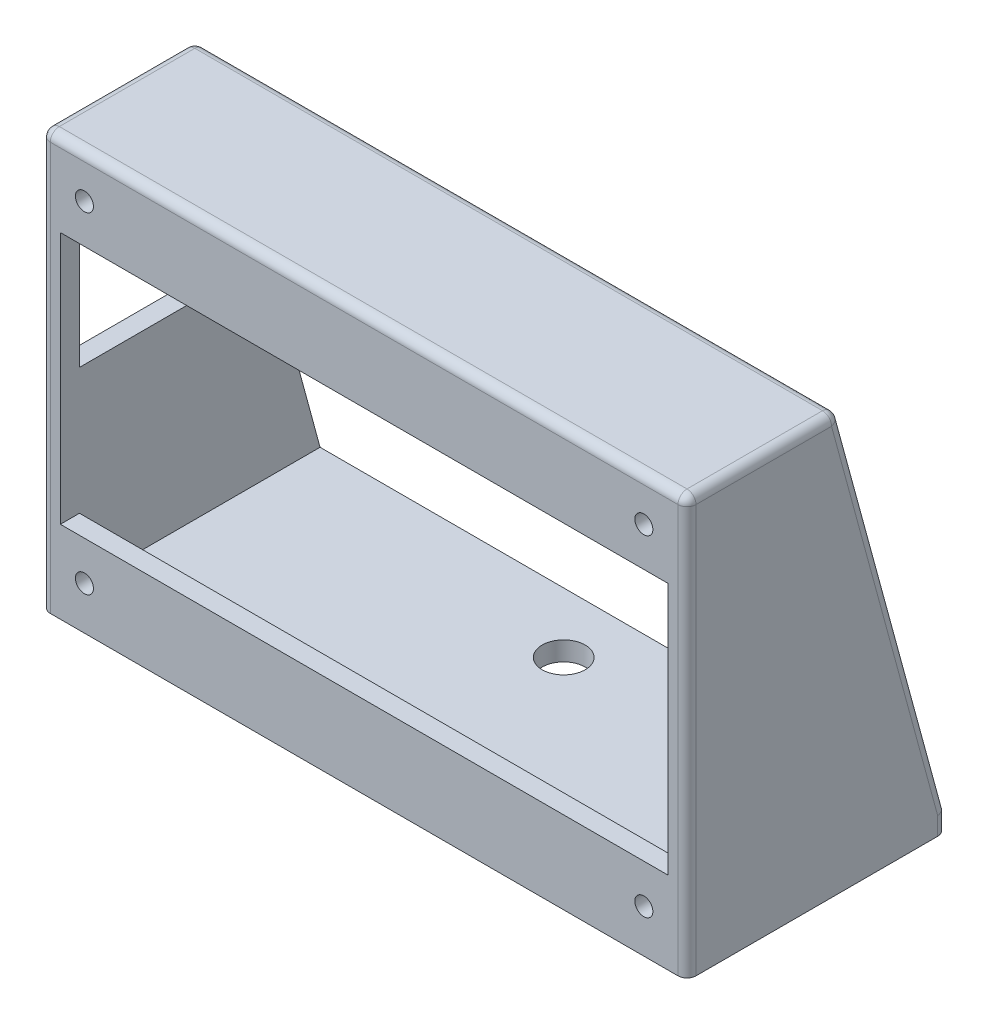
ISO-10303-21;
HEADER;
FILE_DESCRIPTION(('STEP AP214'),'2;1');
FILE_NAME('part.step','',(''),(''),'','','');
FILE_SCHEMA(('AUTOMOTIVE_DESIGN { 1 0 10303 214 1 1 1 1 }'));
ENDSEC;
DATA;
#1=APPLICATION_CONTEXT('core data for automotive mechanical design processes');
#2=APPLICATION_PROTOCOL_DEFINITION('international standard','automotive_design',2000,#1);
#3=PRODUCT_CONTEXT('',#1,'mechanical');
#4=PRODUCT('Part','Part','',(#3));
#5=PRODUCT_RELATED_PRODUCT_CATEGORY('part','',(#4));
#6=PRODUCT_DEFINITION_FORMATION('','',#4);
#7=PRODUCT_DEFINITION_CONTEXT('part definition',#1,'design');
#8=PRODUCT_DEFINITION('design','',#6,#7);
#9=PRODUCT_DEFINITION_SHAPE('','',#8);
#10=(LENGTH_UNIT() NAMED_UNIT(*) SI_UNIT(.MILLI.,.METRE.));
#11=(NAMED_UNIT(*) PLANE_ANGLE_UNIT() SI_UNIT($,.RADIAN.));
#12=(NAMED_UNIT(*) SI_UNIT($,.STERADIAN.) SOLID_ANGLE_UNIT());
#13=UNCERTAINTY_MEASURE_WITH_UNIT(LENGTH_MEASURE(1.E-05),#10,'distance_accuracy_value','');
#14=(GEOMETRIC_REPRESENTATION_CONTEXT(3) GLOBAL_UNCERTAINTY_ASSIGNED_CONTEXT((#13)) GLOBAL_UNIT_ASSIGNED_CONTEXT((#10,
#11,#12)) REPRESENTATION_CONTEXT('',''));
#15=CARTESIAN_POINT('',(0.,0.,0.));
#16=DIRECTION('',(0.,0.,1.));
#17=DIRECTION('',(1.,0.,0.));
#18=AXIS2_PLACEMENT_3D('',#15,#16,#17);
#19=CARTESIAN_POINT('',(53.675,34.675,-23.5875));
#20=DIRECTION('',(0.,-0.262469585009027,0.964940265998465));
#21=DIRECTION('',(0.,-0.964940265998465,-0.262469585009027));
#22=AXIS2_PLACEMENT_3D('',#19,#20,#21);
#23=PLANE('',#22);
#24=DIRECTION('',(-1.,0.,0.));
#25=VECTOR('',#24,1.);
#26=CARTESIAN_POINT('',(50.5,31.5,-24.4511191915376));
#27=LINE('',#26,#25);
#28=CARTESIAN_POINT('',(50.5,31.5,-24.4511191915376));
#29=VERTEX_POINT('',#28);
#30=CARTESIAN_POINT('',(-52.175,31.5,-24.4511191915376));
#31=VERTEX_POINT('',#30);
#32=EDGE_CURVE('E223',#29,#31,#27,.T.);
#33=ORIENTED_EDGE('',*,*,#32,.T.);
#34=DIRECTION('',(0.,0.964940265998465,0.262469585009027));
#35=VECTOR('',#34,1.);
#36=CARTESIAN_POINT('',(-52.175,34.675,-23.5875));
#37=LINE('',#36,#35);
#38=CARTESIAN_POINT('',(-52.175,33.5687043775135,-23.8884190964073));
#39=VERTEX_POINT('',#38);
#40=EDGE_CURVE('E359',#31,#39,#37,.T.);
#41=ORIENTED_EDGE('',*,*,#40,.T.);
#42=DIRECTION('',(-1.,0.,0.));
#43=VECTOR('',#42,1.);
#44=CARTESIAN_POINT('',(53.675,33.5687043775135,-23.8884190964073));
#45=LINE('',#44,#43);
#46=CARTESIAN_POINT('',(52.175,33.5687043775135,-23.8884190964073));
#47=VERTEX_POINT('',#46);
#48=EDGE_CURVE('E357',#39,#47,#45,.F.);
#49=ORIENTED_EDGE('',*,*,#48,.T.);
#50=DIRECTION('',(0.,0.964940265998465,0.262469585009027));
#51=VECTOR('',#50,1.);
#52=CARTESIAN_POINT('',(52.175,34.675,-23.5875));
#53=LINE('',#52,#51);
#54=CARTESIAN_POINT('',(52.175,-31.5,-41.5875));
#55=VERTEX_POINT('',#54);
#56=EDGE_CURVE('E355',#47,#55,#53,.F.);
#57=ORIENTED_EDGE('',*,*,#56,.T.);
#58=DIRECTION('',(-1.,0.,0.));
#59=VECTOR('',#58,1.);
#60=CARTESIAN_POINT('',(53.675,-31.5,-41.5875));
#61=LINE('',#60,#59);
#62=CARTESIAN_POINT('',(50.5,-31.5,-41.5875));
#63=VERTEX_POINT('',#62);
#64=EDGE_CURVE('E221',#55,#63,#61,.T.);
#65=ORIENTED_EDGE('',*,*,#64,.T.);
#66=DIRECTION('',(0.,-0.964940265998465,-0.262469585009027));
#67=VECTOR('',#66,1.);
#68=CARTESIAN_POINT('',(50.5,-11.5926491250708,-36.1725802304688));
#69=LINE('',#68,#67);
#70=EDGE_CURVE('E227',#29,#63,#69,.T.);
#71=ORIENTED_EDGE('',*,*,#70,.F.);
#72=EDGE_LOOP('',(#33,#41,#49,#57,#65,#71));
#73=FACE_BOUND('',#72,.T.);
#74=ADVANCED_FACE('F35',(#73),#23,.F.);
#75=CARTESIAN_POINT('',(0.,0.,-1.5875));
#76=DIRECTION('',(0.,0.,-1.));
#77=DIRECTION('',(-1.,0.,0.));
#78=AXIS2_PLACEMENT_3D('',#75,#76,#77);
#79=PLANE('',#78);
#80=CARTESIAN_POINT('',(-46.5,27.5,-1.5875));
#81=DIRECTION('',(0.,0.,1.));
#82=DIRECTION('',(1.,0.,0.));
#83=AXIS2_PLACEMENT_3D('',#80,#81,#82);
#84=CIRCLE('',#83,1.5);
#85=CARTESIAN_POINT('',(-45.,27.5,-1.5875));
#86=VERTEX_POINT('',#85);
#87=EDGE_CURVE('E265',#86,#86,#84,.T.);
#88=ORIENTED_EDGE('',*,*,#87,.T.);
#89=EDGE_LOOP('',(#88));
#90=FACE_BOUND('',#89,.T.);
#91=CARTESIAN_POINT('',(46.5,27.5,-1.5875));
#92=DIRECTION('',(0.,0.,1.));
#93=DIRECTION('',(1.,0.,0.));
#94=AXIS2_PLACEMENT_3D('',#91,#92,#93);
#95=CIRCLE('',#94,1.5);
#96=CARTESIAN_POINT('',(48.,27.5,-1.5875));
#97=VERTEX_POINT('',#96);
#98=EDGE_CURVE('E266',#97,#97,#95,.T.);
#99=ORIENTED_EDGE('',*,*,#98,.T.);
#100=EDGE_LOOP('',(#99));
#101=FACE_BOUND('',#100,.T.);
#102=DIRECTION('',(-1.,0.,0.));
#103=VECTOR('',#102,1.);
#104=CARTESIAN_POINT('',(-50.5,21.,-1.5875));
#105=LINE('',#104,#103);
#106=CARTESIAN_POINT('',(50.5,21.,-1.5875));
#107=VERTEX_POINT('',#106);
#108=CARTESIAN_POINT('',(-50.5,21.,-1.5875));
#109=VERTEX_POINT('',#108);
#110=EDGE_CURVE('E205',#107,#109,#105,.T.);
#111=ORIENTED_EDGE('',*,*,#110,.T.);
#112=DIRECTION('',(0.,-1.,0.));
#113=VECTOR('',#112,1.);
#114=CARTESIAN_POINT('',(-50.5,31.5,-1.5875));
#115=LINE('',#114,#113);
#116=CARTESIAN_POINT('',(-50.5,0.,-1.5875));
#117=VERTEX_POINT('',#116);
#118=EDGE_CURVE('E202',#109,#117,#115,.T.);
#119=ORIENTED_EDGE('',*,*,#118,.T.);
#120=DIRECTION('',(1.,0.,0.));
#121=VECTOR('',#120,1.);
#122=CARTESIAN_POINT('',(-75.9,0.,-1.5875));
#123=LINE('',#122,#121);
#124=CARTESIAN_POINT('',(-53.675,0.,-1.5875));
#125=VERTEX_POINT('',#124);
#126=EDGE_CURVE('E188',#125,#117,#123,.T.);
#127=ORIENTED_EDGE('',*,*,#126,.F.);
#128=DIRECTION('',(0.,-1.,0.));
#129=VECTOR('',#128,1.);
#130=CARTESIAN_POINT('',(-53.675,-34.675,-1.5875));
#131=LINE('',#130,#129);
#132=CARTESIAN_POINT('',(-53.675,31.5,-1.5875));
#133=VERTEX_POINT('',#132);
#134=EDGE_CURVE('E218',#133,#125,#131,.T.);
#135=ORIENTED_EDGE('',*,*,#134,.F.);
#136=DIRECTION('',(1.,0.,0.));
#137=VECTOR('',#136,1.);
#138=CARTESIAN_POINT('',(50.5,31.5,-1.5875));
#139=LINE('',#138,#137);
#140=CARTESIAN_POINT('',(50.5,31.5,-1.5875));
#141=VERTEX_POINT('',#140);
#142=EDGE_CURVE('E243',#133,#141,#139,.T.);
#143=ORIENTED_EDGE('',*,*,#142,.T.);
#144=DIRECTION('',(0.,-1.,0.));
#145=VECTOR('',#144,1.);
#146=CARTESIAN_POINT('',(50.5,-31.5,-1.5875));
#147=LINE('',#146,#145);
#148=EDGE_CURVE('E246',#141,#107,#147,.T.);
#149=ORIENTED_EDGE('',*,*,#148,.T.);
#150=EDGE_LOOP('',(#111,#119,#127,#135,#143,#149));
#151=FACE_BOUND('',#150,.T.);
#152=ADVANCED_FACE('F203',(#90,#101,#151),#79,.T.);
#153=CARTESIAN_POINT('',(46.5,-27.5,-1.5875));
#154=DIRECTION('',(0.,0.,1.));
#155=DIRECTION('',(1.,0.,0.));
#156=AXIS2_PLACEMENT_3D('',#153,#154,#155);
#157=CIRCLE('',#156,1.5);
#158=CARTESIAN_POINT('',(48.,-27.5,-1.5875));
#159=VERTEX_POINT('',#158);
#160=EDGE_CURVE('E273',#159,#159,#157,.T.);
#161=ORIENTED_EDGE('',*,*,#160,.T.);
#162=EDGE_LOOP('',(#161));
#163=FACE_BOUND('',#162,.T.);
#164=CARTESIAN_POINT('',(-46.5,-27.5,-1.5875));
#165=DIRECTION('',(0.,0.,1.));
#166=DIRECTION('',(1.,0.,0.));
#167=AXIS2_PLACEMENT_3D('',#164,#165,#166);
#168=CIRCLE('',#167,1.5);
#169=CARTESIAN_POINT('',(-45.,-27.5,-1.5875));
#170=VERTEX_POINT('',#169);
#171=EDGE_CURVE('E279',#170,#170,#168,.T.);
#172=ORIENTED_EDGE('',*,*,#171,.T.);
#173=EDGE_LOOP('',(#172));
#174=FACE_BOUND('',#173,.T.);
#175=DIRECTION('',(-1.,0.,0.));
#176=VECTOR('',#175,1.);
#177=CARTESIAN_POINT('',(50.5,-31.5,-1.5875));
#178=LINE('',#177,#176);
#179=CARTESIAN_POINT('',(50.5,-31.5,-1.5875));
#180=VERTEX_POINT('',#179);
#181=CARTESIAN_POINT('',(-50.5,-31.5,-1.5875));
#182=VERTEX_POINT('',#181);
#183=EDGE_CURVE('E241',#180,#182,#178,.T.);
#184=ORIENTED_EDGE('',*,*,#183,.T.);
#185=DIRECTION('',(0.,1.,0.));
#186=VECTOR('',#185,1.);
#187=CARTESIAN_POINT('',(-50.5,-31.5,-1.5875));
#188=LINE('',#187,#186);
#189=CARTESIAN_POINT('',(-50.5,-21.,-1.5875));
#190=VERTEX_POINT('',#189);
#191=EDGE_CURVE('E236',#182,#190,#188,.T.);
#192=ORIENTED_EDGE('',*,*,#191,.T.);
#193=DIRECTION('',(1.,0.,0.));
#194=VECTOR('',#193,1.);
#195=CARTESIAN_POINT('',(-50.5,-21.,-1.5875));
#196=LINE('',#195,#194);
#197=CARTESIAN_POINT('',(50.5,-21.,-1.5875));
#198=VERTEX_POINT('',#197);
#199=EDGE_CURVE('E297',#190,#198,#196,.T.);
#200=ORIENTED_EDGE('',*,*,#199,.T.);
#201=EDGE_CURVE('E248',#198,#180,#147,.T.);
#202=ORIENTED_EDGE('',*,*,#201,.T.);
#203=EDGE_LOOP('',(#184,#192,#200,#202));
#204=FACE_BOUND('',#203,.T.);
#205=ADVANCED_FACE('F519',(#163,#174,#204),#79,.T.);
#206=CARTESIAN_POINT('',(53.675,-34.675,1.5875));
#207=DIRECTION('',(-1.,0.,0.));
#208=DIRECTION('',(0.,0.,1.));
#209=AXIS2_PLACEMENT_3D('',#206,#207,#208);
#210=PLANE('',#209);
#211=DIRECTION('',(0.,0.,-1.));
#212=VECTOR('',#211,1.);
#213=CARTESIAN_POINT('',(53.675,-34.675,1.5875));
#214=LINE('',#213,#212);
#215=CARTESIAN_POINT('',(53.675,-34.675,0.0874999999999999));
#216=VERTEX_POINT('',#215);
#217=CARTESIAN_POINT('',(53.675,-34.675,-40.0875));
#218=VERTEX_POINT('',#217);
#219=EDGE_CURVE('E311',#216,#218,#214,.T.);
#220=ORIENTED_EDGE('',*,*,#219,.T.);
#221=DIRECTION('',(0.,-1.,0.));
#222=VECTOR('',#221,1.);
#223=CARTESIAN_POINT('',(53.675,-34.675,-40.0875));
#224=LINE('',#223,#222);
#225=CARTESIAN_POINT('',(53.675,-31.7003645527176,-40.0875));
#226=VERTEX_POINT('',#225);
#227=EDGE_CURVE('E339',#218,#226,#224,.F.);
#228=ORIENTED_EDGE('',*,*,#227,.T.);
#229=DIRECTION('',(0.,0.964940265998465,0.262469585009027));
#230=VECTOR('',#229,1.);
#231=CARTESIAN_POINT('',(53.675,-23.9151546608288,-37.9698758510918));
#232=LINE('',#231,#230);
#233=CARTESIAN_POINT('',(53.675,33.175,-22.4410086974097));
#234=VERTEX_POINT('',#233);
#235=EDGE_CURVE('E337',#226,#234,#232,.T.);
#236=ORIENTED_EDGE('',*,*,#235,.T.);
#237=DIRECTION('',(0.,0.,-1.));
#238=VECTOR('',#237,1.);
#239=CARTESIAN_POINT('',(53.675,33.175,1.5875));
#240=LINE('',#239,#238);
#241=CARTESIAN_POINT('',(53.675,33.175,0.0874999999999999));
#242=VERTEX_POINT('',#241);
#243=EDGE_CURVE('E335',#234,#242,#240,.F.);
#244=ORIENTED_EDGE('',*,*,#243,.T.);
#245=DIRECTION('',(0.,1.,0.));
#246=VECTOR('',#245,1.);
#247=CARTESIAN_POINT('',(53.675,-34.675,0.0874999999999999));
#248=LINE('',#247,#246);
#249=EDGE_CURVE('E333',#242,#216,#248,.F.);
#250=ORIENTED_EDGE('',*,*,#249,.T.);
#251=EDGE_LOOP('',(#220,#228,#236,#244,#250));
#252=FACE_BOUND('',#251,.T.);
#253=ADVANCED_FACE('F485',(#252),#210,.F.);
#254=CARTESIAN_POINT('',(-53.675,34.675,1.5875));
#255=DIRECTION('',(0.,-1.,0.));
#256=DIRECTION('',(0.,0.,-1.));
#257=AXIS2_PLACEMENT_3D('',#254,#255,#256);
#258=PLANE('',#257);
#259=DIRECTION('',(0.,0.,-1.));
#260=VECTOR('',#259,1.);
#261=CARTESIAN_POINT('',(52.175,34.675,1.5875));
#262=LINE('',#261,#260);
#263=CARTESIAN_POINT('',(52.175,34.675,0.0874999999999999));
#264=VERTEX_POINT('',#263);
#265=CARTESIAN_POINT('',(52.175,34.675,-22.4410086974097));
#266=VERTEX_POINT('',#265);
#267=EDGE_CURVE('E367',#264,#266,#262,.T.);
#268=ORIENTED_EDGE('',*,*,#267,.T.);
#269=DIRECTION('',(-1.,0.,0.));
#270=VECTOR('',#269,1.);
#271=CARTESIAN_POINT('',(-53.675,34.675,-22.4410086974097));
#272=LINE('',#271,#270);
#273=CARTESIAN_POINT('',(-52.175,34.675,-22.4410086974097));
#274=VERTEX_POINT('',#273);
#275=EDGE_CURVE('E369',#266,#274,#272,.T.);
#276=ORIENTED_EDGE('',*,*,#275,.T.);
#277=DIRECTION('',(0.,0.,-1.));
#278=VECTOR('',#277,1.);
#279=CARTESIAN_POINT('',(-52.175,34.675,1.5875));
#280=LINE('',#279,#278);
#281=CARTESIAN_POINT('',(-52.175,34.675,0.0874999999999999));
#282=VERTEX_POINT('',#281);
#283=EDGE_CURVE('E365',#274,#282,#280,.F.);
#284=ORIENTED_EDGE('',*,*,#283,.T.);
#285=DIRECTION('',(-1.,0.,0.));
#286=VECTOR('',#285,1.);
#287=CARTESIAN_POINT('',(-53.675,34.675,0.0874999999999999));
#288=LINE('',#287,#286);
#289=EDGE_CURVE('E363',#282,#264,#288,.F.);
#290=ORIENTED_EDGE('',*,*,#289,.T.);
#291=EDGE_LOOP('',(#268,#276,#284,#290));
#292=FACE_BOUND('',#291,.T.);
#293=ADVANCED_FACE('F425',(#292),#258,.F.);
#294=CARTESIAN_POINT('',(-53.675,-34.675,1.5875));
#295=DIRECTION('',(1.,0.,0.));
#296=DIRECTION('',(0.,0.,-1.));
#297=AXIS2_PLACEMENT_3D('',#294,#295,#296);
#298=PLANE('',#297);
#299=DIRECTION('',(0.,0.964940265998465,0.262469585009027));
#300=VECTOR('',#299,1.);
#301=CARTESIAN_POINT('',(-53.675,-23.9151546608288,-37.9698758510918));
#302=LINE('',#301,#300);
#303=CARTESIAN_POINT('',(-53.675,0.,-31.4648092263103));
#304=VERTEX_POINT('',#303);
#305=CARTESIAN_POINT('',(-53.675,-31.7003645527176,-40.0875));
#306=VERTEX_POINT('',#305);
#307=EDGE_CURVE('E347',#304,#306,#302,.F.);
#308=ORIENTED_EDGE('',*,*,#307,.T.);
#309=DIRECTION('',(0.,1.,0.));
#310=VECTOR('',#309,1.);
#311=CARTESIAN_POINT('',(-53.675,-34.675,-40.0875));
#312=LINE('',#311,#310);
#313=CARTESIAN_POINT('',(-53.675,-34.675,-40.0875));
#314=VERTEX_POINT('',#313);
#315=EDGE_CURVE('E349',#306,#314,#312,.F.);
#316=ORIENTED_EDGE('',*,*,#315,.T.);
#317=DIRECTION('',(0.,0.,-1.));
#318=VECTOR('',#317,1.);
#319=CARTESIAN_POINT('',(-53.675,-34.675,1.5875));
#320=LINE('',#319,#318);
#321=CARTESIAN_POINT('',(-53.675,-34.675,0.0874999999999999));
#322=VERTEX_POINT('',#321);
#323=EDGE_CURVE('E314',#322,#314,#320,.T.);
#324=ORIENTED_EDGE('',*,*,#323,.F.);
#325=DIRECTION('',(0.,-1.,0.));
#326=VECTOR('',#325,1.);
#327=CARTESIAN_POINT('',(-53.675,-34.675,0.0874999999999999));
#328=LINE('',#327,#326);
#329=CARTESIAN_POINT('',(-53.675,33.175,0.0874999999999999));
#330=VERTEX_POINT('',#329);
#331=EDGE_CURVE('E341',#322,#330,#328,.F.);
#332=ORIENTED_EDGE('',*,*,#331,.T.);
#333=DIRECTION('',(0.,0.,-1.));
#334=VECTOR('',#333,1.);
#335=CARTESIAN_POINT('',(-53.675,33.175,1.5875));
#336=LINE('',#335,#334);
#337=CARTESIAN_POINT('',(-53.675,33.175,-22.4410086974097));
#338=VERTEX_POINT('',#337);
#339=EDGE_CURVE('E343',#330,#338,#336,.T.);
#340=ORIENTED_EDGE('',*,*,#339,.T.);
#341=DIRECTION('',(0.,0.964940265998465,0.262469585009027));
#342=VECTOR('',#341,1.);
#343=CARTESIAN_POINT('',(-53.675,-23.9151546608288,-37.9698758510918));
#344=LINE('',#343,#342);
#345=CARTESIAN_POINT('',(-53.675,31.5,-22.8966188220791));
#346=VERTEX_POINT('',#345);
#347=EDGE_CURVE('E345',#338,#346,#344,.F.);
#348=ORIENTED_EDGE('',*,*,#347,.T.);
#349=DIRECTION('',(0.,0.,1.));
#350=VECTOR('',#349,1.);
#351=CARTESIAN_POINT('',(-53.675,31.5,1.5875));
#352=LINE('',#351,#350);
#353=EDGE_CURVE('E216',#346,#133,#352,.T.);
#354=ORIENTED_EDGE('',*,*,#353,.T.);
#355=ORIENTED_EDGE('',*,*,#134,.T.);
#356=DIRECTION('',(0.,0.,-1.));
#357=VECTOR('',#356,1.);
#358=CARTESIAN_POINT('',(-53.675,0.,1.5875));
#359=LINE('',#358,#357);
#360=EDGE_CURVE('E196',#125,#304,#359,.T.);
#361=ORIENTED_EDGE('',*,*,#360,.T.);
#362=EDGE_LOOP('',(#308,#316,#324,#332,#340,#348,#354,#355,#361));
#363=FACE_BOUND('',#362,.T.);
#364=ADVANCED_FACE('F434',(#363),#298,.F.);
#365=CARTESIAN_POINT('',(-53.675,-34.675,1.5875));
#366=DIRECTION('',(0.,1.,0.));
#367=DIRECTION('',(0.,0.,1.));
#368=AXIS2_PLACEMENT_3D('',#365,#366,#367);
#369=PLANE('',#368);
#370=CARTESIAN_POINT('',(0.,-34.675,-31.5875));
#371=DIRECTION('',(0.,1.,0.));
#372=DIRECTION('',(0.,0.,1.));
#373=AXIS2_PLACEMENT_3D('',#370,#371,#372);
#374=CIRCLE('',#373,3.571875);
#375=CARTESIAN_POINT('',(0.,-34.675,-28.015625));
#376=VERTEX_POINT('',#375);
#377=EDGE_CURVE('E233',#376,#376,#374,.T.);
#378=ORIENTED_EDGE('',*,*,#377,.T.);
#379=EDGE_LOOP('',(#378));
#380=FACE_BOUND('',#379,.T.);
#381=DIRECTION('',(-1.,0.,0.));
#382=VECTOR('',#381,1.);
#383=CARTESIAN_POINT('',(53.675,-34.675,-41.5875));
#384=LINE('',#383,#382);
#385=CARTESIAN_POINT('',(52.175,-34.675,-41.5875));
#386=VERTEX_POINT('',#385);
#387=CARTESIAN_POINT('',(-52.175,-34.675,-41.5875));
#388=VERTEX_POINT('',#387);
#389=EDGE_CURVE('E258',#386,#388,#384,.T.);
#390=ORIENTED_EDGE('',*,*,#389,.F.);
#391=CARTESIAN_POINT('',(52.175,-34.675,-40.0875));
#392=DIRECTION('',(0.,1.,0.));
#393=DIRECTION('',(0.,0.,1.));
#394=AXIS2_PLACEMENT_3D('',#391,#392,#393);
#395=CIRCLE('',#394,1.5);
#396=EDGE_CURVE('E331',#386,#218,#395,.F.);
#397=ORIENTED_EDGE('',*,*,#396,.T.);
#398=ORIENTED_EDGE('',*,*,#219,.F.);
#399=CARTESIAN_POINT('',(52.175,-34.675,0.0874999999999999));
#400=DIRECTION('',(0.,1.,0.));
#401=DIRECTION('',(0.,0.,1.));
#402=AXIS2_PLACEMENT_3D('',#399,#400,#401);
#403=CIRCLE('',#402,1.5);
#404=CARTESIAN_POINT('',(52.175,-34.675,1.5875));
#405=VERTEX_POINT('',#404);
#406=EDGE_CURVE('E327',#216,#405,#403,.F.);
#407=ORIENTED_EDGE('',*,*,#406,.T.);
#408=DIRECTION('',(1.,0.,0.));
#409=VECTOR('',#408,1.);
#410=CARTESIAN_POINT('',(-53.675,-34.675,1.5875));
#411=LINE('',#410,#409);
#412=CARTESIAN_POINT('',(-52.175,-34.675,1.5875));
#413=VERTEX_POINT('',#412);
#414=EDGE_CURVE('E303',#413,#405,#411,.T.);
#415=ORIENTED_EDGE('',*,*,#414,.F.);
#416=CARTESIAN_POINT('',(-52.175,-34.675,0.0874999999999999));
#417=DIRECTION('',(0.,1.,0.));
#418=DIRECTION('',(0.,0.,1.));
#419=AXIS2_PLACEMENT_3D('',#416,#417,#418);
#420=CIRCLE('',#419,1.5);
#421=EDGE_CURVE('E325',#413,#322,#420,.F.);
#422=ORIENTED_EDGE('',*,*,#421,.T.);
#423=ORIENTED_EDGE('',*,*,#323,.T.);
#424=CARTESIAN_POINT('',(-52.175,-34.675,-40.0875));
#425=DIRECTION('',(0.,1.,0.));
#426=DIRECTION('',(0.,0.,1.));
#427=AXIS2_PLACEMENT_3D('',#424,#425,#426);
#428=CIRCLE('',#427,1.5);
#429=EDGE_CURVE('E329',#314,#388,#428,.F.);
#430=ORIENTED_EDGE('',*,*,#429,.T.);
#431=EDGE_LOOP('',(#390,#397,#398,#407,#415,#422,#423,#430));
#432=FACE_BOUND('',#431,.T.);
#433=ADVANCED_FACE('F477',(#380,#432),#369,.F.);
#434=CARTESIAN_POINT('',(0.,0.,1.5875));
#435=DIRECTION('',(0.,0.,-1.));
#436=DIRECTION('',(-1.,0.,0.));
#437=AXIS2_PLACEMENT_3D('',#434,#435,#436);
#438=PLANE('',#437);
#439=CARTESIAN_POINT('',(-46.5,-27.5,1.5875));
#440=DIRECTION('',(0.,0.,1.));
#441=DIRECTION('',(1.,0.,0.));
#442=AXIS2_PLACEMENT_3D('',#439,#440,#441);
#443=CIRCLE('',#442,1.5);
#444=CARTESIAN_POINT('',(-45.,-27.5,1.5875));
#445=VERTEX_POINT('',#444);
#446=EDGE_CURVE('E261',#445,#445,#443,.T.);
#447=ORIENTED_EDGE('',*,*,#446,.F.);
#448=EDGE_LOOP('',(#447));
#449=FACE_BOUND('',#448,.T.);
#450=CARTESIAN_POINT('',(46.5,-27.5,1.5875));
#451=DIRECTION('',(0.,0.,1.));
#452=DIRECTION('',(1.,0.,0.));
#453=AXIS2_PLACEMENT_3D('',#450,#451,#452);
#454=CIRCLE('',#453,1.5);
#455=CARTESIAN_POINT('',(48.,-27.5,1.5875));
#456=VERTEX_POINT('',#455);
#457=EDGE_CURVE('E276',#456,#456,#454,.T.);
#458=ORIENTED_EDGE('',*,*,#457,.F.);
#459=EDGE_LOOP('',(#458));
#460=FACE_BOUND('',#459,.T.);
#461=CARTESIAN_POINT('',(46.5,27.5,1.5875));
#462=DIRECTION('',(0.,0.,1.));
#463=DIRECTION('',(1.,0.,0.));
#464=AXIS2_PLACEMENT_3D('',#461,#462,#463);
#465=CIRCLE('',#464,1.5);
#466=CARTESIAN_POINT('',(48.,27.5,1.5875));
#467=VERTEX_POINT('',#466);
#468=EDGE_CURVE('E270',#467,#467,#465,.T.);
#469=ORIENTED_EDGE('',*,*,#468,.F.);
#470=EDGE_LOOP('',(#469));
#471=FACE_BOUND('',#470,.T.);
#472=CARTESIAN_POINT('',(-46.5,27.5,1.5875));
#473=DIRECTION('',(0.,0.,1.));
#474=DIRECTION('',(1.,0.,0.));
#475=AXIS2_PLACEMENT_3D('',#472,#473,#474);
#476=CIRCLE('',#475,1.5);
#477=CARTESIAN_POINT('',(-45.,27.5,1.5875));
#478=VERTEX_POINT('',#477);
#479=EDGE_CURVE('E262',#478,#478,#476,.T.);
#480=ORIENTED_EDGE('',*,*,#479,.F.);
#481=EDGE_LOOP('',(#480));
#482=FACE_BOUND('',#481,.T.);
#483=DIRECTION('',(-1.,0.,0.));
#484=VECTOR('',#483,1.);
#485=CARTESIAN_POINT('',(-50.5,21.,1.5875));
#486=LINE('',#485,#484);
#487=CARTESIAN_POINT('',(50.5,21.,1.5875));
#488=VERTEX_POINT('',#487);
#489=CARTESIAN_POINT('',(-50.5,21.,1.5875));
#490=VERTEX_POINT('',#489);
#491=EDGE_CURVE('E287',#488,#490,#486,.T.);
#492=ORIENTED_EDGE('',*,*,#491,.F.);
#493=DIRECTION('',(0.,1.,0.));
#494=VECTOR('',#493,1.);
#495=CARTESIAN_POINT('',(50.5,-21.,1.5875));
#496=LINE('',#495,#494);
#497=CARTESIAN_POINT('',(50.5,-21.,1.5875));
#498=VERTEX_POINT('',#497);
#499=EDGE_CURVE('E269',#498,#488,#496,.T.);
#500=ORIENTED_EDGE('',*,*,#499,.F.);
#501=DIRECTION('',(1.,0.,0.));
#502=VECTOR('',#501,1.);
#503=CARTESIAN_POINT('',(-50.5,-21.,1.5875));
#504=LINE('',#503,#502);
#505=CARTESIAN_POINT('',(-50.5,-21.,1.5875));
#506=VERTEX_POINT('',#505);
#507=EDGE_CURVE('E293',#506,#498,#504,.T.);
#508=ORIENTED_EDGE('',*,*,#507,.F.);
#509=DIRECTION('',(0.,-1.,0.));
#510=VECTOR('',#509,1.);
#511=CARTESIAN_POINT('',(-50.5,-21.,1.5875));
#512=LINE('',#511,#510);
#513=EDGE_CURVE('E290',#490,#506,#512,.T.);
#514=ORIENTED_EDGE('',*,*,#513,.F.);
#515=EDGE_LOOP('',(#492,#500,#508,#514));
#516=FACE_BOUND('',#515,.T.);
#517=ORIENTED_EDGE('',*,*,#414,.T.);
#518=DIRECTION('',(0.,1.,0.));
#519=VECTOR('',#518,1.);
#520=CARTESIAN_POINT('',(52.175,0.,1.5875));
#521=LINE('',#520,#519);
#522=CARTESIAN_POINT('',(52.175,33.175,1.5875));
#523=VERTEX_POINT('',#522);
#524=EDGE_CURVE('E11',#405,#523,#521,.T.);
#525=ORIENTED_EDGE('',*,*,#524,.T.);
#526=DIRECTION('',(-1.,0.,0.));
#527=VECTOR('',#526,1.);
#528=CARTESIAN_POINT('',(0.,33.175,1.5875));
#529=LINE('',#528,#527);
#530=CARTESIAN_POINT('',(-52.175,33.175,1.5875));
#531=VERTEX_POINT('',#530);
#532=EDGE_CURVE('E44',#523,#531,#529,.T.);
#533=ORIENTED_EDGE('',*,*,#532,.T.);
#534=DIRECTION('',(0.,-1.,0.));
#535=VECTOR('',#534,1.);
#536=CARTESIAN_POINT('',(-52.175,0.,1.5875));
#537=LINE('',#536,#535);
#538=EDGE_CURVE('E372',#531,#413,#537,.T.);
#539=ORIENTED_EDGE('',*,*,#538,.T.);
#540=EDGE_LOOP('',(#517,#525,#533,#539));
#541=FACE_BOUND('',#540,.T.);
#542=ADVANCED_FACE('F571',(#449,#460,#471,#482,#516,#541),#438,.F.);
#543=CARTESIAN_POINT('',(50.5,-21.,-1.5875));
#544=DIRECTION('',(1.,0.,0.));
#545=DIRECTION('',(0.,0.,-1.));
#546=AXIS2_PLACEMENT_3D('',#543,#544,#545);
#547=PLANE('',#546);
#548=DIRECTION('',(0.,0.,1.));
#549=VECTOR('',#548,1.);
#550=CARTESIAN_POINT('',(50.5,31.5,-41.5875));
#551=LINE('',#550,#549);
#552=EDGE_CURVE('E256',#29,#141,#551,.T.);
#553=ORIENTED_EDGE('',*,*,#552,.F.);
#554=ORIENTED_EDGE('',*,*,#70,.T.);
#555=DIRECTION('',(0.,0.,1.));
#556=VECTOR('',#555,1.);
#557=CARTESIAN_POINT('',(50.5,-31.5,-41.5875));
#558=LINE('',#557,#556);
#559=EDGE_CURVE('E253',#63,#180,#558,.T.);
#560=ORIENTED_EDGE('',*,*,#559,.T.);
#561=ORIENTED_EDGE('',*,*,#201,.F.);
#562=DIRECTION('',(0.,0.,1.));
#563=VECTOR('',#562,1.);
#564=CARTESIAN_POINT('',(50.5,-21.,-1.5875));
#565=LINE('',#564,#563);
#566=EDGE_CURVE('E301',#198,#498,#565,.T.);
#567=ORIENTED_EDGE('',*,*,#566,.T.);
#568=ORIENTED_EDGE('',*,*,#499,.T.);
#569=DIRECTION('',(0.,0.,1.));
#570=VECTOR('',#569,1.);
#571=CARTESIAN_POINT('',(50.5,21.,-1.5875));
#572=LINE('',#571,#570);
#573=EDGE_CURVE('E300',#107,#488,#572,.T.);
#574=ORIENTED_EDGE('',*,*,#573,.F.);
#575=ORIENTED_EDGE('',*,*,#148,.F.);
#576=EDGE_LOOP('',(#553,#554,#560,#561,#567,#568,#574,#575));
#577=FACE_BOUND('',#576,.T.);
#578=ADVANCED_FACE('F452',(#577),#547,.F.);
#579=CARTESIAN_POINT('',(-50.5,-21.,-1.5875));
#580=DIRECTION('',(0.,-1.,0.));
#581=DIRECTION('',(0.,0.,-1.));
#582=AXIS2_PLACEMENT_3D('',#579,#580,#581);
#583=PLANE('',#582);
#584=ORIENTED_EDGE('',*,*,#566,.F.);
#585=ORIENTED_EDGE('',*,*,#199,.F.);
#586=DIRECTION('',(0.,0.,1.));
#587=VECTOR('',#586,1.);
#588=CARTESIAN_POINT('',(-50.5,-21.,-1.5875));
#589=LINE('',#588,#587);
#590=EDGE_CURVE('E304',#190,#506,#589,.T.);
#591=ORIENTED_EDGE('',*,*,#590,.T.);
#592=ORIENTED_EDGE('',*,*,#507,.T.);
#593=EDGE_LOOP('',(#584,#585,#591,#592));
#594=FACE_BOUND('',#593,.T.);
#595=ADVANCED_FACE('F560',(#594),#583,.F.);
#596=CARTESIAN_POINT('',(-50.5,-21.,-1.5875));
#597=DIRECTION('',(-1.,0.,0.));
#598=DIRECTION('',(0.,0.,1.));
#599=AXIS2_PLACEMENT_3D('',#596,#597,#598);
#600=PLANE('',#599);
#601=DIRECTION('',(0.,0.964940265998465,0.262469585009027));
#602=VECTOR('',#601,1.);
#603=CARTESIAN_POINT('',(-50.5,-11.5926491250708,-36.1725802304688));
#604=LINE('',#603,#602);
#605=CARTESIAN_POINT('',(-50.5,-31.5,-41.5875));
#606=VERTEX_POINT('',#605);
#607=CARTESIAN_POINT('',(-50.5,0.,-33.0193095957688));
#608=VERTEX_POINT('',#607);
#609=EDGE_CURVE('E212',#606,#608,#604,.T.);
#610=ORIENTED_EDGE('',*,*,#609,.T.);
#611=DIRECTION('',(0.,0.,-1.));
#612=VECTOR('',#611,1.);
#613=CARTESIAN_POINT('',(-50.5,0.,-1.5875));
#614=LINE('',#613,#612);
#615=EDGE_CURVE('E193',#117,#608,#614,.T.);
#616=ORIENTED_EDGE('',*,*,#615,.F.);
#617=ORIENTED_EDGE('',*,*,#118,.F.);
#618=DIRECTION('',(0.,0.,1.));
#619=VECTOR('',#618,1.);
#620=CARTESIAN_POINT('',(-50.5,21.,-1.5875));
#621=LINE('',#620,#619);
#622=EDGE_CURVE('E306',#109,#490,#621,.T.);
#623=ORIENTED_EDGE('',*,*,#622,.T.);
#624=ORIENTED_EDGE('',*,*,#513,.T.);
#625=ORIENTED_EDGE('',*,*,#590,.F.);
#626=ORIENTED_EDGE('',*,*,#191,.F.);
#627=DIRECTION('',(0.,0.,1.));
#628=VECTOR('',#627,1.);
#629=CARTESIAN_POINT('',(-50.5,-31.5,-41.5875));
#630=LINE('',#629,#628);
#631=EDGE_CURVE('E240',#606,#182,#630,.T.);
#632=ORIENTED_EDGE('',*,*,#631,.F.);
#633=EDGE_LOOP('',(#610,#616,#617,#623,#624,#625,#626,#632));
#634=FACE_BOUND('',#633,.T.);
#635=ADVANCED_FACE('F210',(#634),#600,.F.);
#636=CARTESIAN_POINT('',(-50.5,21.,-1.5875));
#637=DIRECTION('',(0.,1.,0.));
#638=DIRECTION('',(0.,0.,1.));
#639=AXIS2_PLACEMENT_3D('',#636,#637,#638);
#640=PLANE('',#639);
#641=ORIENTED_EDGE('',*,*,#622,.F.);
#642=ORIENTED_EDGE('',*,*,#110,.F.);
#643=ORIENTED_EDGE('',*,*,#573,.T.);
#644=ORIENTED_EDGE('',*,*,#491,.T.);
#645=EDGE_LOOP('',(#641,#642,#643,#644));
#646=FACE_BOUND('',#645,.T.);
#647=ADVANCED_FACE('F548',(#646),#640,.F.);
#648=CARTESIAN_POINT('',(-46.5,27.5,-1.5875));
#649=DIRECTION('',(0.,0.,1.));
#650=DIRECTION('',(1.,0.,0.));
#651=AXIS2_PLACEMENT_3D('',#648,#649,#650);
#652=CYLINDRICAL_SURFACE('',#651,1.5);
#653=ORIENTED_EDGE('',*,*,#87,.F.);
#654=EDGE_LOOP('',(#653));
#655=FACE_BOUND('',#654,.T.);
#656=ORIENTED_EDGE('',*,*,#479,.T.);
#657=EDGE_LOOP('',(#656));
#658=FACE_BOUND('',#657,.T.);
#659=ADVANCED_FACE('F544',(#655,#658),#652,.F.);
#660=CARTESIAN_POINT('',(46.5,27.5,-1.5875));
#661=DIRECTION('',(0.,0.,1.));
#662=DIRECTION('',(1.,0.,0.));
#663=AXIS2_PLACEMENT_3D('',#660,#661,#662);
#664=CYLINDRICAL_SURFACE('',#663,1.5);
#665=ORIENTED_EDGE('',*,*,#98,.F.);
#666=EDGE_LOOP('',(#665));
#667=FACE_BOUND('',#666,.T.);
#668=ORIENTED_EDGE('',*,*,#468,.T.);
#669=EDGE_LOOP('',(#668));
#670=FACE_BOUND('',#669,.T.);
#671=ADVANCED_FACE('F547',(#667,#670),#664,.F.);
#672=CARTESIAN_POINT('',(46.5,-27.5,-1.5875));
#673=DIRECTION('',(0.,0.,1.));
#674=DIRECTION('',(1.,0.,0.));
#675=AXIS2_PLACEMENT_3D('',#672,#673,#674);
#676=CYLINDRICAL_SURFACE('',#675,1.5);
#677=ORIENTED_EDGE('',*,*,#160,.F.);
#678=EDGE_LOOP('',(#677));
#679=FACE_BOUND('',#678,.T.);
#680=ORIENTED_EDGE('',*,*,#457,.T.);
#681=EDGE_LOOP('',(#680));
#682=FACE_BOUND('',#681,.T.);
#683=ADVANCED_FACE('F552',(#679,#682),#676,.F.);
#684=CARTESIAN_POINT('',(-46.5,-27.5,-1.5875));
#685=DIRECTION('',(0.,0.,1.));
#686=DIRECTION('',(1.,0.,0.));
#687=AXIS2_PLACEMENT_3D('',#684,#685,#686);
#688=CYLINDRICAL_SURFACE('',#687,1.5);
#689=ORIENTED_EDGE('',*,*,#171,.F.);
#690=EDGE_LOOP('',(#689));
#691=FACE_BOUND('',#690,.T.);
#692=ORIENTED_EDGE('',*,*,#446,.T.);
#693=EDGE_LOOP('',(#692));
#694=FACE_BOUND('',#693,.T.);
#695=ADVANCED_FACE('F543',(#691,#694),#688,.F.);
#696=CARTESIAN_POINT('',(0.,0.,-41.5875));
#697=DIRECTION('',(0.,0.,1.));
#698=DIRECTION('',(1.,0.,0.));
#699=AXIS2_PLACEMENT_3D('',#696,#697,#698);
#700=PLANE('',#699);
#701=ORIENTED_EDGE('',*,*,#64,.F.);
#702=DIRECTION('',(0.,-1.,0.));
#703=VECTOR('',#702,1.);
#704=CARTESIAN_POINT('',(52.175,0.,-41.5875));
#705=LINE('',#704,#703);
#706=EDGE_CURVE('E322',#55,#386,#705,.T.);
#707=ORIENTED_EDGE('',*,*,#706,.T.);
#708=ORIENTED_EDGE('',*,*,#389,.T.);
#709=DIRECTION('',(0.,1.,0.));
#710=VECTOR('',#709,1.);
#711=CARTESIAN_POINT('',(-52.175,0.,-41.5875));
#712=LINE('',#711,#710);
#713=CARTESIAN_POINT('',(-52.175,-31.5,-41.5875));
#714=VERTEX_POINT('',#713);
#715=EDGE_CURVE('E319',#388,#714,#712,.T.);
#716=ORIENTED_EDGE('',*,*,#715,.T.);
#717=EDGE_CURVE('E220',#606,#714,#61,.T.);
#718=ORIENTED_EDGE('',*,*,#717,.F.);
#719=DIRECTION('',(-1.,0.,0.));
#720=VECTOR('',#719,1.);
#721=CARTESIAN_POINT('',(50.5,-31.5,-41.5875));
#722=LINE('',#721,#720);
#723=EDGE_CURVE('E237',#63,#606,#722,.T.);
#724=ORIENTED_EDGE('',*,*,#723,.F.);
#725=EDGE_LOOP('',(#701,#707,#708,#716,#718,#724));
#726=FACE_BOUND('',#725,.T.);
#727=ADVANCED_FACE('F460',(#726),#700,.F.);
#728=CARTESIAN_POINT('',(50.5,31.5,-41.5875));
#729=DIRECTION('',(0.,-1.,0.));
#730=DIRECTION('',(0.,0.,-1.));
#731=AXIS2_PLACEMENT_3D('',#728,#729,#730);
#732=PLANE('',#731);
#733=ORIENTED_EDGE('',*,*,#353,.F.);
#734=CARTESIAN_POINT('',(-52.175,31.5,-22.8966188220791));
#735=DIRECTION('',(0.,-1.,0.));
#736=DIRECTION('',(0.,0.,1.));
#737=AXIS2_PLACEMENT_3D('',#734,#735,#736);
#738=ELLIPSE('',#737,1.5545003694585,1.5);
#739=EDGE_CURVE('E361',#346,#31,#738,.T.);
#740=ORIENTED_EDGE('',*,*,#739,.T.);
#741=ORIENTED_EDGE('',*,*,#32,.F.);
#742=ORIENTED_EDGE('',*,*,#552,.T.);
#743=ORIENTED_EDGE('',*,*,#142,.F.);
#744=EDGE_LOOP('',(#733,#740,#741,#742,#743));
#745=FACE_BOUND('',#744,.T.);
#746=ADVANCED_FACE('F445',(#745),#732,.T.);
#747=CARTESIAN_POINT('',(50.5,-31.5,-41.5875));
#748=DIRECTION('',(0.,1.,0.));
#749=DIRECTION('',(0.,0.,1.));
#750=AXIS2_PLACEMENT_3D('',#747,#748,#749);
#751=PLANE('',#750);
#752=CARTESIAN_POINT('',(0.,-31.5,-31.5875));
#753=DIRECTION('',(0.,1.,0.));
#754=DIRECTION('',(0.,0.,1.));
#755=AXIS2_PLACEMENT_3D('',#752,#753,#754);
#756=CIRCLE('',#755,3.571875);
#757=CARTESIAN_POINT('',(0.,-31.5,-28.015625));
#758=VERTEX_POINT('',#757);
#759=EDGE_CURVE('E230',#758,#758,#756,.T.);
#760=ORIENTED_EDGE('',*,*,#759,.F.);
#761=EDGE_LOOP('',(#760));
#762=FACE_BOUND('',#761,.T.);
#763=ORIENTED_EDGE('',*,*,#183,.F.);
#764=ORIENTED_EDGE('',*,*,#559,.F.);
#765=ORIENTED_EDGE('',*,*,#723,.T.);
#766=ORIENTED_EDGE('',*,*,#631,.T.);
#767=EDGE_LOOP('',(#763,#764,#765,#766));
#768=FACE_BOUND('',#767,.T.);
#769=ADVANCED_FACE('F457',(#762,#768),#751,.T.);
#770=CARTESIAN_POINT('',(0.,-56.9,-31.5875));
#771=DIRECTION('',(0.,1.,0.));
#772=DIRECTION('',(0.,0.,1.));
#773=AXIS2_PLACEMENT_3D('',#770,#771,#772);
#774=CYLINDRICAL_SURFACE('',#773,3.571875);
#775=ORIENTED_EDGE('',*,*,#759,.T.);
#776=EDGE_LOOP('',(#775));
#777=FACE_BOUND('',#776,.T.);
#778=ORIENTED_EDGE('',*,*,#377,.F.);
#779=EDGE_LOOP('',(#778));
#780=FACE_BOUND('',#779,.T.);
#781=ADVANCED_FACE('F525',(#777,#780),#774,.F.);
#782=ORIENTED_EDGE('',*,*,#717,.T.);
#783=DIRECTION('',(0.,0.964940265998465,0.262469585009027));
#784=VECTOR('',#783,1.);
#785=CARTESIAN_POINT('',(-52.175,34.675,-23.5875));
#786=LINE('',#785,#784);
#787=CARTESIAN_POINT('',(-52.175,0.,-33.0193095957688));
#788=VERTEX_POINT('',#787);
#789=EDGE_CURVE('E351',#714,#788,#786,.T.);
#790=ORIENTED_EDGE('',*,*,#789,.T.);
#791=DIRECTION('',(1.,0.,0.));
#792=VECTOR('',#791,1.);
#793=CARTESIAN_POINT('',(53.675,0.,-33.0193095957688));
#794=LINE('',#793,#792);
#795=EDGE_CURVE('E317',#788,#608,#794,.T.);
#796=ORIENTED_EDGE('',*,*,#795,.T.);
#797=ORIENTED_EDGE('',*,*,#609,.F.);
#798=EDGE_LOOP('',(#782,#790,#796,#797));
#799=FACE_BOUND('',#798,.T.);
#800=ADVANCED_FACE('F465',(#799),#23,.F.);
#801=CARTESIAN_POINT('',(-75.9,0.,-1.5875));
#802=DIRECTION('',(0.,-1.,0.));
#803=DIRECTION('',(0.,0.,-1.));
#804=AXIS2_PLACEMENT_3D('',#801,#802,#803);
#805=PLANE('',#804);
#806=ORIENTED_EDGE('',*,*,#795,.F.);
#807=CARTESIAN_POINT('',(-52.175,0.,-31.4648092263103));
#808=DIRECTION('',(0.,-1.,0.));
#809=DIRECTION('',(0.,0.,1.));
#810=AXIS2_PLACEMENT_3D('',#807,#808,#809);
#811=ELLIPSE('',#810,1.5545003694585,1.5);
#812=EDGE_CURVE('E353',#788,#304,#811,.F.);
#813=ORIENTED_EDGE('',*,*,#812,.T.);
#814=ORIENTED_EDGE('',*,*,#360,.F.);
#815=ORIENTED_EDGE('',*,*,#126,.T.);
#816=ORIENTED_EDGE('',*,*,#615,.T.);
#817=EDGE_LOOP('',(#806,#813,#814,#815,#816));
#818=FACE_BOUND('',#817,.T.);
#819=ADVANCED_FACE('F191',(#818),#805,.F.);
#820=CARTESIAN_POINT('',(-52.175,0.,0.0874999999999999));
#821=DIRECTION('',(0.,-1.,0.));
#822=DIRECTION('',(0.,0.,-1.));
#823=AXIS2_PLACEMENT_3D('',#820,#821,#822);
#824=CYLINDRICAL_SURFACE('',#823,1.5);
#825=CARTESIAN_POINT('',(-52.175,33.175,0.0874999999999999));
#826=DIRECTION('',(0.,1.,0.));
#827=DIRECTION('',(0.,0.,1.));
#828=AXIS2_PLACEMENT_3D('',#825,#826,#827);
#829=CIRCLE('',#828,1.5);
#830=EDGE_CURVE('E208',#330,#531,#829,.T.);
#831=ORIENTED_EDGE('',*,*,#830,.F.);
#832=ORIENTED_EDGE('',*,*,#331,.F.);
#833=ORIENTED_EDGE('',*,*,#421,.F.);
#834=ORIENTED_EDGE('',*,*,#538,.F.);
#835=EDGE_LOOP('',(#831,#832,#833,#834));
#836=FACE_BOUND('',#835,.T.);
#837=ADVANCED_FACE('F530',(#836),#824,.T.);
#838=CARTESIAN_POINT('',(-52.175,33.175,0.0874999999999999));
#839=DIRECTION('',(0.,0.,1.));
#840=DIRECTION('',(1.,0.,0.));
#841=AXIS2_PLACEMENT_3D('',#838,#839,#840);
#842=SPHERICAL_SURFACE('',#841,1.5);
#843=CARTESIAN_POINT('',(-52.175,33.175,0.0874999999999999));
#844=DIRECTION('',(0.,0.,1.));
#845=DIRECTION('',(1.,0.,0.));
#846=AXIS2_PLACEMENT_3D('',#843,#844,#845);
#847=CIRCLE('',#846,1.5);
#848=EDGE_CURVE('E404',#330,#282,#847,.F.);
#849=ORIENTED_EDGE('',*,*,#848,.F.);
#850=ORIENTED_EDGE('',*,*,#830,.T.);
#851=CARTESIAN_POINT('',(-52.175,33.175,0.0874999999999999));
#852=DIRECTION('',(-1.,0.,0.));
#853=DIRECTION('',(0.,0.,1.));
#854=AXIS2_PLACEMENT_3D('',#851,#852,#853);
#855=CIRCLE('',#854,1.5);
#856=EDGE_CURVE('E407',#282,#531,#855,.F.);
#857=ORIENTED_EDGE('',*,*,#856,.F.);
#858=EDGE_LOOP('',(#849,#850,#857));
#859=FACE_BOUND('',#858,.T.);
#860=ADVANCED_FACE('F414',(#859),#842,.T.);
#861=CARTESIAN_POINT('',(52.175,0.,0.0874999999999999));
#862=DIRECTION('',(0.,1.,0.));
#863=DIRECTION('',(0.,0.,1.));
#864=AXIS2_PLACEMENT_3D('',#861,#862,#863);
#865=CYLINDRICAL_SURFACE('',#864,1.5);
#866=ORIENTED_EDGE('',*,*,#406,.F.);
#867=ORIENTED_EDGE('',*,*,#249,.F.);
#868=CARTESIAN_POINT('',(52.175,33.175,0.0874999999999999));
#869=DIRECTION('',(0.,1.,0.));
#870=DIRECTION('',(0.,0.,1.));
#871=AXIS2_PLACEMENT_3D('',#868,#869,#870);
#872=CIRCLE('',#871,1.5);
#873=EDGE_CURVE('E401',#523,#242,#872,.T.);
#874=ORIENTED_EDGE('',*,*,#873,.F.);
#875=ORIENTED_EDGE('',*,*,#524,.F.);
#876=EDGE_LOOP('',(#866,#867,#874,#875));
#877=FACE_BOUND('',#876,.T.);
#878=ADVANCED_FACE('F490',(#877),#865,.T.);
#879=CARTESIAN_POINT('',(0.,33.175,0.0874999999999999));
#880=DIRECTION('',(-1.,0.,0.));
#881=DIRECTION('',(0.,0.,1.));
#882=AXIS2_PLACEMENT_3D('',#879,#880,#881);
#883=CYLINDRICAL_SURFACE('',#882,1.5);
#884=ORIENTED_EDGE('',*,*,#856,.T.);
#885=ORIENTED_EDGE('',*,*,#532,.F.);
#886=CARTESIAN_POINT('',(52.175,33.175,0.0874999999999999));
#887=DIRECTION('',(1.,0.,0.));
#888=DIRECTION('',(0.,0.,-1.));
#889=AXIS2_PLACEMENT_3D('',#886,#887,#888);
#890=CIRCLE('',#889,1.5);
#891=EDGE_CURVE('E398',#264,#523,#890,.T.);
#892=ORIENTED_EDGE('',*,*,#891,.F.);
#893=ORIENTED_EDGE('',*,*,#289,.F.);
#894=EDGE_LOOP('',(#884,#885,#892,#893));
#895=FACE_BOUND('',#894,.T.);
#896=ADVANCED_FACE('F420',(#895),#883,.T.);
#897=CARTESIAN_POINT('',(-52.175,33.175,1.5875));
#898=DIRECTION('',(0.,0.,-1.));
#899=DIRECTION('',(-1.,0.,0.));
#900=AXIS2_PLACEMENT_3D('',#897,#898,#899);
#901=CYLINDRICAL_SURFACE('',#900,1.5);
#902=ORIENTED_EDGE('',*,*,#848,.T.);
#903=ORIENTED_EDGE('',*,*,#283,.F.);
#904=CARTESIAN_POINT('',(-52.175,33.175,-22.4410086974097));
#905=DIRECTION('',(0.,0.,-1.));
#906=DIRECTION('',(-1.,0.,0.));
#907=AXIS2_PLACEMENT_3D('',#904,#905,#906);
#908=CIRCLE('',#907,1.5);
#909=EDGE_CURVE('E395',#338,#274,#908,.T.);
#910=ORIENTED_EDGE('',*,*,#909,.F.);
#911=ORIENTED_EDGE('',*,*,#339,.F.);
#912=EDGE_LOOP('',(#902,#903,#910,#911));
#913=FACE_BOUND('',#912,.T.);
#914=ADVANCED_FACE('F431',(#913),#901,.T.);
#915=CARTESIAN_POINT('',(-52.175,34.2812956224865,-22.1400896010023));
#916=DIRECTION('',(0.,0.964940265998465,0.262469585009027));
#917=DIRECTION('',(0.,-0.262469585009027,0.964940265998465));
#918=AXIS2_PLACEMENT_3D('',#915,#916,#917);
#919=CYLINDRICAL_SURFACE('',#918,1.5);
#920=ORIENTED_EDGE('',*,*,#739,.F.);
#921=ORIENTED_EDGE('',*,*,#347,.F.);
#922=CARTESIAN_POINT('',(-52.175,33.175,-22.4410086974097));
#923=DIRECTION('',(0.,0.964940265998465,0.262469585009028));
#924=DIRECTION('',(0.,-0.262469585009028,0.964940265998465));
#925=AXIS2_PLACEMENT_3D('',#922,#923,#924);
#926=CIRCLE('',#925,1.5);
#927=EDGE_CURVE('E392',#39,#338,#926,.T.);
#928=ORIENTED_EDGE('',*,*,#927,.F.);
#929=ORIENTED_EDGE('',*,*,#40,.F.);
#930=EDGE_LOOP('',(#920,#921,#928,#929));
#931=FACE_BOUND('',#930,.T.);
#932=ADVANCED_FACE('F440',(#931),#919,.T.);
#933=CARTESIAN_POINT('',(52.175,33.175,0.0874999999999999));
#934=DIRECTION('',(0.,0.,1.));
#935=DIRECTION('',(1.,0.,0.));
#936=AXIS2_PLACEMENT_3D('',#933,#934,#935);
#937=SPHERICAL_SURFACE('',#936,1.5);
#938=ORIENTED_EDGE('',*,*,#891,.T.);
#939=ORIENTED_EDGE('',*,*,#873,.T.);
#940=CARTESIAN_POINT('',(52.175,33.175,0.0874999999999999));
#941=DIRECTION('',(0.,0.,1.));
#942=DIRECTION('',(1.,0.,0.));
#943=AXIS2_PLACEMENT_3D('',#940,#941,#942);
#944=CIRCLE('',#943,1.5);
#945=EDGE_CURVE('E389',#264,#242,#944,.F.);
#946=ORIENTED_EDGE('',*,*,#945,.F.);
#947=EDGE_LOOP('',(#938,#939,#946));
#948=FACE_BOUND('',#947,.T.);
#949=ADVANCED_FACE('F492',(#948),#937,.T.);
#950=CARTESIAN_POINT('',(-52.175,33.175,-22.4410086974097));
#951=DIRECTION('',(0.,0.,1.));
#952=DIRECTION('',(1.,0.,0.));
#953=AXIS2_PLACEMENT_3D('',#950,#951,#952);
#954=SPHERICAL_SURFACE('',#953,1.5);
#955=ORIENTED_EDGE('',*,*,#927,.T.);
#956=ORIENTED_EDGE('',*,*,#909,.T.);
#957=CARTESIAN_POINT('',(-52.175,33.175,-22.4410086974097));
#958=DIRECTION('',(-1.,0.,0.));
#959=DIRECTION('',(0.,0.,1.));
#960=AXIS2_PLACEMENT_3D('',#957,#958,#959);
#961=CIRCLE('',#960,1.5);
#962=EDGE_CURVE('E387',#39,#274,#961,.F.);
#963=ORIENTED_EDGE('',*,*,#962,.F.);
#964=EDGE_LOOP('',(#955,#956,#963));
#965=FACE_BOUND('',#964,.T.);
#966=ADVANCED_FACE('F505',(#965),#954,.T.);
#967=CARTESIAN_POINT('',(52.175,33.175,1.5875));
#968=DIRECTION('',(0.,0.,-1.));
#969=DIRECTION('',(-1.,0.,0.));
#970=AXIS2_PLACEMENT_3D('',#967,#968,#969);
#971=CYLINDRICAL_SURFACE('',#970,1.5);
#972=ORIENTED_EDGE('',*,*,#945,.T.);
#973=ORIENTED_EDGE('',*,*,#243,.F.);
#974=CARTESIAN_POINT('',(52.175,33.175,-22.4410086974097));
#975=DIRECTION('',(0.,0.,-1.));
#976=DIRECTION('',(-1.,0.,0.));
#977=AXIS2_PLACEMENT_3D('',#974,#975,#976);
#978=CIRCLE('',#977,1.5);
#979=EDGE_CURVE('E384',#266,#234,#978,.T.);
#980=ORIENTED_EDGE('',*,*,#979,.F.);
#981=ORIENTED_EDGE('',*,*,#267,.F.);
#982=EDGE_LOOP('',(#972,#973,#980,#981));
#983=FACE_BOUND('',#982,.T.);
#984=ADVANCED_FACE('F494',(#983),#971,.T.);
#985=CARTESIAN_POINT('',(-53.675,33.175,-22.4410086974097));
#986=DIRECTION('',(-1.,0.,0.));
#987=DIRECTION('',(0.,0.,1.));
#988=AXIS2_PLACEMENT_3D('',#985,#986,#987);
#989=CYLINDRICAL_SURFACE('',#988,1.5);
#990=ORIENTED_EDGE('',*,*,#962,.T.);
#991=ORIENTED_EDGE('',*,*,#275,.F.);
#992=CARTESIAN_POINT('',(52.175,33.175,-22.4410086974097));
#993=DIRECTION('',(1.,0.,0.));
#994=DIRECTION('',(0.,0.,-1.));
#995=AXIS2_PLACEMENT_3D('',#992,#993,#994);
#996=CIRCLE('',#995,1.5);
#997=EDGE_CURVE('E381',#47,#266,#996,.T.);
#998=ORIENTED_EDGE('',*,*,#997,.F.);
#999=ORIENTED_EDGE('',*,*,#48,.F.);
#1000=EDGE_LOOP('',(#990,#991,#998,#999));
#1001=FACE_BOUND('',#1000,.T.);
#1002=ADVANCED_FACE('F503',(#1001),#989,.T.);
#1003=CARTESIAN_POINT('',(52.175,33.175,-22.4410086974097));
#1004=DIRECTION('',(0.,0.,1.));
#1005=DIRECTION('',(1.,0.,0.));
#1006=AXIS2_PLACEMENT_3D('',#1003,#1004,#1005);
#1007=SPHERICAL_SURFACE('',#1006,1.5);
#1008=ORIENTED_EDGE('',*,*,#997,.T.);
#1009=ORIENTED_EDGE('',*,*,#979,.T.);
#1010=CARTESIAN_POINT('',(52.175,33.175,-22.4410086974097));
#1011=DIRECTION('',(0.,0.964940265998465,0.262469585009029));
#1012=DIRECTION('',(0.,-0.262469585009029,0.964940265998465));
#1013=AXIS2_PLACEMENT_3D('',#1010,#1011,#1012);
#1014=CIRCLE('',#1013,1.5);
#1015=EDGE_CURVE('E378',#47,#234,#1014,.F.);
#1016=ORIENTED_EDGE('',*,*,#1015,.F.);
#1017=EDGE_LOOP('',(#1008,#1009,#1016));
#1018=FACE_BOUND('',#1017,.T.);
#1019=ADVANCED_FACE('F499',(#1018),#1007,.T.);
#1020=CARTESIAN_POINT('',(52.175,-23.9151546608288,-37.9698758510918));
#1021=DIRECTION('',(0.,0.964940265998465,0.262469585009027));
#1022=DIRECTION('',(0.,-0.262469585009027,0.964940265998465));
#1023=AXIS2_PLACEMENT_3D('',#1020,#1021,#1022);
#1024=CYLINDRICAL_SURFACE('',#1023,1.5);
#1025=ORIENTED_EDGE('',*,*,#1015,.T.);
#1026=ORIENTED_EDGE('',*,*,#235,.F.);
#1027=CARTESIAN_POINT('',(52.175,-31.7003645527176,-40.0875));
#1028=DIRECTION('',(0.,0.991196314056521,0.132400404080831));
#1029=DIRECTION('',(0.,-0.13240040408083,0.991196314056521));
#1030=AXIS2_PLACEMENT_3D('',#1027,#1028,#1029);
#1031=ELLIPSE('',#1030,1.51332281882806,1.5);
#1032=EDGE_CURVE('E375',#55,#226,#1031,.F.);
#1033=ORIENTED_EDGE('',*,*,#1032,.F.);
#1034=ORIENTED_EDGE('',*,*,#56,.F.);
#1035=EDGE_LOOP('',(#1025,#1026,#1033,#1034));
#1036=FACE_BOUND('',#1035,.T.);
#1037=ADVANCED_FACE('F586',(#1036),#1024,.T.);
#1038=CARTESIAN_POINT('',(52.175,0.,-40.0875));
#1039=DIRECTION('',(0.,-1.,0.));
#1040=DIRECTION('',(0.,0.,-1.));
#1041=AXIS2_PLACEMENT_3D('',#1038,#1039,#1040);
#1042=CYLINDRICAL_SURFACE('',#1041,1.5);
#1043=ORIENTED_EDGE('',*,*,#1032,.T.);
#1044=ORIENTED_EDGE('',*,*,#227,.F.);
#1045=ORIENTED_EDGE('',*,*,#396,.F.);
#1046=ORIENTED_EDGE('',*,*,#706,.F.);
#1047=EDGE_LOOP('',(#1043,#1044,#1045,#1046));
#1048=FACE_BOUND('',#1047,.T.);
#1049=ADVANCED_FACE('F480',(#1048),#1042,.T.);
#1050=CARTESIAN_POINT('',(-52.175,34.2812956224865,-22.1400896010023));
#1051=DIRECTION('',(0.,0.964940265998465,0.262469585009027));
#1052=DIRECTION('',(0.,-0.262469585009027,0.964940265998465));
#1053=AXIS2_PLACEMENT_3D('',#1050,#1051,#1052);
#1054=CYLINDRICAL_SURFACE('',#1053,1.5);
#1055=ORIENTED_EDGE('',*,*,#812,.F.);
#1056=ORIENTED_EDGE('',*,*,#789,.F.);
#1057=CARTESIAN_POINT('',(-52.175,-31.7003645527175,-40.0875));
#1058=DIRECTION('',(0.,0.991196314056521,0.132400404080831));
#1059=DIRECTION('',(0.,-0.13240040408083,0.991196314056521));
#1060=AXIS2_PLACEMENT_3D('',#1057,#1058,#1059);
#1061=ELLIPSE('',#1060,1.51332281882806,1.5);
#1062=EDGE_CURVE('E39',#306,#714,#1061,.F.);
#1063=ORIENTED_EDGE('',*,*,#1062,.F.);
#1064=ORIENTED_EDGE('',*,*,#307,.F.);
#1065=EDGE_LOOP('',(#1055,#1056,#1063,#1064));
#1066=FACE_BOUND('',#1065,.T.);
#1067=ADVANCED_FACE('F37',(#1066),#1054,.T.);
#1068=CARTESIAN_POINT('',(-52.175,0.,-40.0875));
#1069=DIRECTION('',(0.,1.,0.));
#1070=DIRECTION('',(0.,0.,1.));
#1071=AXIS2_PLACEMENT_3D('',#1068,#1069,#1070);
#1072=CYLINDRICAL_SURFACE('',#1071,1.5);
#1073=ORIENTED_EDGE('',*,*,#429,.F.);
#1074=ORIENTED_EDGE('',*,*,#315,.F.);
#1075=ORIENTED_EDGE('',*,*,#1062,.T.);
#1076=ORIENTED_EDGE('',*,*,#715,.F.);
#1077=EDGE_LOOP('',(#1073,#1074,#1075,#1076));
#1078=FACE_BOUND('',#1077,.T.);
#1079=ADVANCED_FACE('F474',(#1078),#1072,.T.);
#1080=CLOSED_SHELL('',(#74,#152,#205,#253,#293,#364,#433,#542,#578,#595,#635,#647,#659,#671,
#683,#695,#727,#746,#769,#781,#800,#819,#837,#860,#878,#896,#914,#932,#949,#966,#984,#1002,
#1019,#1037,#1049,#1067,#1079));
#1081=MANIFOLD_SOLID_BREP('B2',#1080);
#1082=ADVANCED_BREP_SHAPE_REPRESENTATION('',(#18,#1081),#14);
#1083=SHAPE_DEFINITION_REPRESENTATION(#9,#1082);
ENDSEC;
END-ISO-10303-21;
